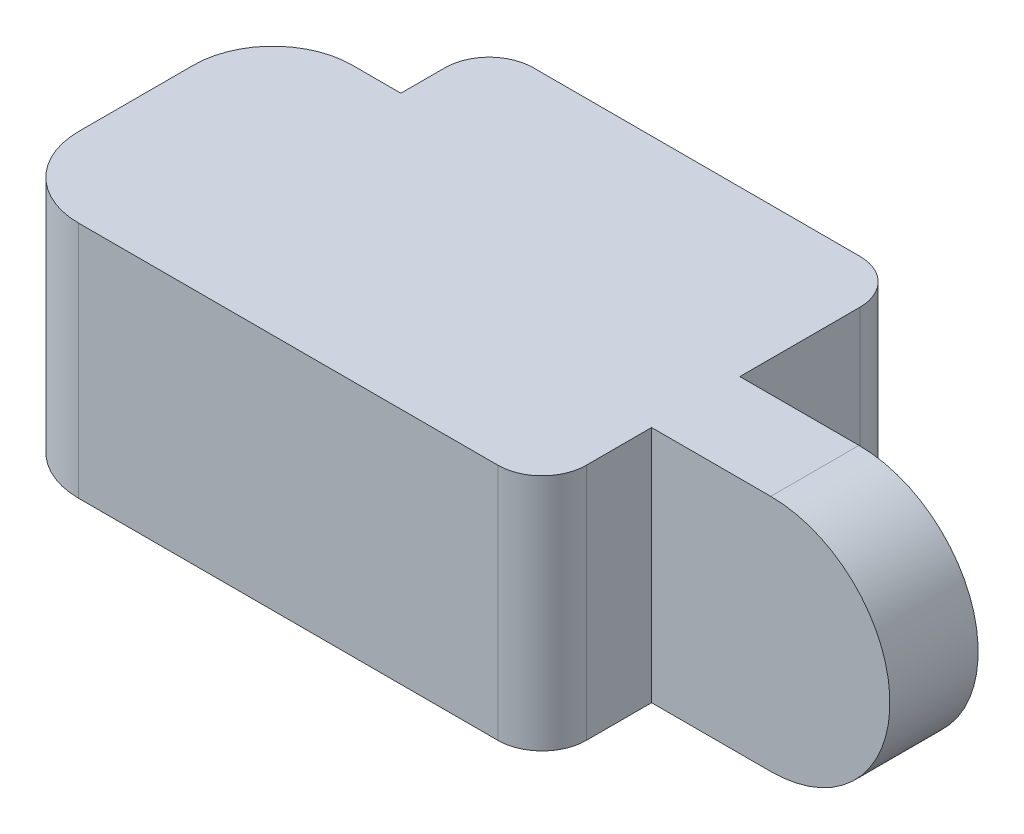
ISO-10303-21;
HEADER;
FILE_DESCRIPTION(('STEP AP214'),'2;1');
FILE_NAME('part.step','',(''),(''),'','','');
FILE_SCHEMA(('AUTOMOTIVE_DESIGN { 1 0 10303 214 1 1 1 1 }'));
ENDSEC;
DATA;
#1=APPLICATION_CONTEXT('core data for automotive mechanical design processes');
#2=APPLICATION_PROTOCOL_DEFINITION('international standard','automotive_design',2000,#1);
#3=PRODUCT_CONTEXT('',#1,'mechanical');
#4=PRODUCT('Part','Part','',(#3));
#5=PRODUCT_RELATED_PRODUCT_CATEGORY('part','',(#4));
#6=PRODUCT_DEFINITION_FORMATION('','',#4);
#7=PRODUCT_DEFINITION_CONTEXT('part definition',#1,'design');
#8=PRODUCT_DEFINITION('design','',#6,#7);
#9=PRODUCT_DEFINITION_SHAPE('','',#8);
#10=(LENGTH_UNIT() NAMED_UNIT(*) SI_UNIT(.MILLI.,.METRE.));
#11=(NAMED_UNIT(*) PLANE_ANGLE_UNIT() SI_UNIT($,.RADIAN.));
#12=(NAMED_UNIT(*) SI_UNIT($,.STERADIAN.) SOLID_ANGLE_UNIT());
#13=UNCERTAINTY_MEASURE_WITH_UNIT(LENGTH_MEASURE(1.E-05),#10,'distance_accuracy_value','');
#14=(GEOMETRIC_REPRESENTATION_CONTEXT(3) GLOBAL_UNCERTAINTY_ASSIGNED_CONTEXT((#13)) GLOBAL_UNIT_ASSIGNED_CONTEXT((#10,
#11,#12)) REPRESENTATION_CONTEXT('',''));
#15=CARTESIAN_POINT('',(0.,0.,0.));
#16=DIRECTION('',(0.,0.,1.));
#17=DIRECTION('',(1.,0.,0.));
#18=AXIS2_PLACEMENT_3D('',#15,#16,#17);
#19=CARTESIAN_POINT('',(-34.29,-34.29,12.7));
#20=DIRECTION('',(1.,0.,0.));
#21=DIRECTION('',(0.,0.,-1.));
#22=AXIS2_PLACEMENT_3D('',#19,#20,#21);
#23=PLANE('',#22);
#24=DIRECTION('',(0.,1.,0.));
#25=VECTOR('',#24,1.);
#26=CARTESIAN_POINT('',(-34.29,-34.29,12.7));
#27=LINE('',#26,#25);
#28=CARTESIAN_POINT('',(-34.29,-34.29,12.7));
#29=VERTEX_POINT('',#28);
#30=CARTESIAN_POINT('',(-34.29,34.29,12.7));
#31=VERTEX_POINT('',#30);
#32=EDGE_CURVE('E195',#29,#31,#27,.T.);
#33=ORIENTED_EDGE('',*,*,#32,.T.);
#34=DIRECTION('',(0.,0.,-1.));
#35=VECTOR('',#34,1.);
#36=CARTESIAN_POINT('',(-34.29,34.29,12.7));
#37=LINE('',#36,#35);
#38=CARTESIAN_POINT('',(-34.29,34.29,31.496));
#39=VERTEX_POINT('',#38);
#40=EDGE_CURVE('E151',#39,#31,#37,.T.);
#41=ORIENTED_EDGE('',*,*,#40,.F.);
#42=DIRECTION('',(0.,1.,0.));
#43=VECTOR('',#42,1.);
#44=CARTESIAN_POINT('',(-34.29,-34.29,31.496));
#45=LINE('',#44,#43);
#46=CARTESIAN_POINT('',(-34.29,-34.29,31.496));
#47=VERTEX_POINT('',#46);
#48=EDGE_CURVE('E39',#47,#39,#45,.T.);
#49=ORIENTED_EDGE('',*,*,#48,.F.);
#50=DIRECTION('',(0.,0.,-1.));
#51=VECTOR('',#50,1.);
#52=CARTESIAN_POINT('',(-34.29,-34.29,12.7));
#53=LINE('',#52,#51);
#54=EDGE_CURVE('E162',#47,#29,#53,.T.);
#55=ORIENTED_EDGE('',*,*,#54,.T.);
#56=EDGE_LOOP('',(#33,#41,#49,#55));
#57=FACE_BOUND('',#56,.T.);
#58=ADVANCED_FACE('F32',(#57),#23,.T.);
#59=CARTESIAN_POINT('',(-46.99,-34.29,31.496));
#60=DIRECTION('',(0.,1.,0.));
#61=DIRECTION('',(0.,0.,1.));
#62=AXIS2_PLACEMENT_3D('',#59,#60,#61);
#63=CYLINDRICAL_SURFACE('',#62,12.7);
#64=ORIENTED_EDGE('',*,*,#48,.T.);
#65=CARTESIAN_POINT('',(-46.99,34.29,31.496));
#66=DIRECTION('',(0.,1.,0.));
#67=DIRECTION('',(0.,0.,-1.));
#68=AXIS2_PLACEMENT_3D('',#65,#66,#67);
#69=CIRCLE('',#68,12.7);
#70=CARTESIAN_POINT('',(-46.99,34.29,44.196));
#71=VERTEX_POINT('',#70);
#72=EDGE_CURVE('E230',#71,#39,#69,.T.);
#73=ORIENTED_EDGE('',*,*,#72,.F.);
#74=DIRECTION('',(0.,1.,0.));
#75=VECTOR('',#74,1.);
#76=CARTESIAN_POINT('',(-46.99,-34.29,44.196));
#77=LINE('',#76,#75);
#78=CARTESIAN_POINT('',(-46.99,-34.29,44.196));
#79=VERTEX_POINT('',#78);
#80=EDGE_CURVE('E197',#79,#71,#77,.T.);
#81=ORIENTED_EDGE('',*,*,#80,.F.);
#82=CARTESIAN_POINT('',(-46.99,-34.29,31.496));
#83=DIRECTION('',(0.,1.,0.));
#84=DIRECTION('',(0.,0.,-1.));
#85=AXIS2_PLACEMENT_3D('',#82,#83,#84);
#86=CIRCLE('',#85,12.7);
#87=EDGE_CURVE('E192',#79,#47,#86,.T.);
#88=ORIENTED_EDGE('',*,*,#87,.T.);
#89=EDGE_LOOP('',(#64,#73,#81,#88));
#90=FACE_BOUND('',#89,.T.);
#91=ADVANCED_FACE('F268',(#90),#63,.T.);
#92=CARTESIAN_POINT('',(-46.99,-34.29,44.196));
#93=DIRECTION('',(0.,0.,1.));
#94=DIRECTION('',(1.,0.,0.));
#95=AXIS2_PLACEMENT_3D('',#92,#93,#94);
#96=PLANE('',#95);
#97=ORIENTED_EDGE('',*,*,#80,.T.);
#98=DIRECTION('',(1.,0.,0.));
#99=VECTOR('',#98,1.);
#100=CARTESIAN_POINT('',(-46.99,34.29,44.196));
#101=LINE('',#100,#99);
#102=CARTESIAN_POINT('',(-167.64,34.29,44.196));
#103=VERTEX_POINT('',#102);
#104=EDGE_CURVE('E262',#103,#71,#101,.T.);
#105=ORIENTED_EDGE('',*,*,#104,.F.);
#106=DIRECTION('',(0.,1.,0.));
#107=VECTOR('',#106,1.);
#108=CARTESIAN_POINT('',(-167.64,-34.29,44.196));
#109=LINE('',#108,#107);
#110=CARTESIAN_POINT('',(-167.64,-34.29,44.196));
#111=VERTEX_POINT('',#110);
#112=EDGE_CURVE('E199',#111,#103,#109,.T.);
#113=ORIENTED_EDGE('',*,*,#112,.F.);
#114=DIRECTION('',(1.,0.,0.));
#115=VECTOR('',#114,1.);
#116=CARTESIAN_POINT('',(-46.99,-34.29,44.196));
#117=LINE('',#116,#115);
#118=EDGE_CURVE('E189',#111,#79,#117,.T.);
#119=ORIENTED_EDGE('',*,*,#118,.T.);
#120=EDGE_LOOP('',(#97,#105,#113,#119));
#121=FACE_BOUND('',#120,.T.);
#122=ADVANCED_FACE('F316',(#121),#96,.T.);
#123=CARTESIAN_POINT('',(-167.64,-34.29,21.336));
#124=DIRECTION('',(0.,1.,0.));
#125=DIRECTION('',(0.,0.,1.));
#126=AXIS2_PLACEMENT_3D('',#123,#124,#125);
#127=CYLINDRICAL_SURFACE('',#126,22.86);
#128=ORIENTED_EDGE('',*,*,#112,.T.);
#129=CARTESIAN_POINT('',(-167.64,34.29,21.336));
#130=DIRECTION('',(0.,1.,0.));
#131=DIRECTION('',(0.,0.,-1.));
#132=AXIS2_PLACEMENT_3D('',#129,#130,#131);
#133=CIRCLE('',#132,22.86);
#134=CARTESIAN_POINT('',(-190.5,34.29,21.336));
#135=VERTEX_POINT('',#134);
#136=EDGE_CURVE('E259',#135,#103,#133,.T.);
#137=ORIENTED_EDGE('',*,*,#136,.F.);
#138=DIRECTION('',(0.,1.,0.));
#139=VECTOR('',#138,1.);
#140=CARTESIAN_POINT('',(-190.5,-34.29,21.336));
#141=LINE('',#140,#139);
#142=CARTESIAN_POINT('',(-190.5,-34.29,21.336));
#143=VERTEX_POINT('',#142);
#144=EDGE_CURVE('E201',#143,#135,#141,.T.);
#145=ORIENTED_EDGE('',*,*,#144,.F.);
#146=CARTESIAN_POINT('',(-167.64,-34.29,21.336));
#147=DIRECTION('',(0.,1.,0.));
#148=DIRECTION('',(0.,0.,-1.));
#149=AXIS2_PLACEMENT_3D('',#146,#147,#148);
#150=CIRCLE('',#149,22.86);
#151=EDGE_CURVE('E186',#143,#111,#150,.T.);
#152=ORIENTED_EDGE('',*,*,#151,.T.);
#153=EDGE_LOOP('',(#128,#137,#145,#152));
#154=FACE_BOUND('',#153,.T.);
#155=ADVANCED_FACE('F274',(#154),#127,.T.);
#156=CARTESIAN_POINT('',(-190.5,-34.29,-11.684));
#157=DIRECTION('',(-1.,0.,0.));
#158=DIRECTION('',(0.,0.,1.));
#159=AXIS2_PLACEMENT_3D('',#156,#157,#158);
#160=PLANE('',#159);
#161=ORIENTED_EDGE('',*,*,#144,.T.);
#162=DIRECTION('',(0.,0.,1.));
#163=VECTOR('',#162,1.);
#164=CARTESIAN_POINT('',(-190.5,34.29,-11.684));
#165=LINE('',#164,#163);
#166=CARTESIAN_POINT('',(-190.5,34.29,-11.684));
#167=VERTEX_POINT('',#166);
#168=EDGE_CURVE('E256',#167,#135,#165,.T.);
#169=ORIENTED_EDGE('',*,*,#168,.F.);
#170=DIRECTION('',(0.,1.,0.));
#171=VECTOR('',#170,1.);
#172=CARTESIAN_POINT('',(-190.5,-34.29,-11.684));
#173=LINE('',#172,#171);
#174=CARTESIAN_POINT('',(-190.5,-34.29,-11.684));
#175=VERTEX_POINT('',#174);
#176=EDGE_CURVE('E203',#175,#167,#173,.T.);
#177=ORIENTED_EDGE('',*,*,#176,.F.);
#178=DIRECTION('',(0.,0.,1.));
#179=VECTOR('',#178,1.);
#180=CARTESIAN_POINT('',(-190.5,-34.29,-11.684));
#181=LINE('',#180,#179);
#182=EDGE_CURVE('E183',#175,#143,#181,.T.);
#183=ORIENTED_EDGE('',*,*,#182,.T.);
#184=EDGE_LOOP('',(#161,#169,#177,#183));
#185=FACE_BOUND('',#184,.T.);
#186=ADVANCED_FACE('F277',(#185),#160,.T.);
#187=CARTESIAN_POINT('',(-167.64,-34.29,-11.684));
#188=DIRECTION('',(0.,1.,0.));
#189=DIRECTION('',(0.,0.,1.));
#190=AXIS2_PLACEMENT_3D('',#187,#188,#189);
#191=CYLINDRICAL_SURFACE('',#190,22.86);
#192=ORIENTED_EDGE('',*,*,#176,.T.);
#193=CARTESIAN_POINT('',(-167.64,34.29,-11.684));
#194=DIRECTION('',(0.,1.,0.));
#195=DIRECTION('',(0.,0.,1.));
#196=AXIS2_PLACEMENT_3D('',#193,#194,#195);
#197=CIRCLE('',#196,22.86);
#198=CARTESIAN_POINT('',(-167.64,34.29,-34.544));
#199=VERTEX_POINT('',#198);
#200=EDGE_CURVE('E253',#199,#167,#197,.T.);
#201=ORIENTED_EDGE('',*,*,#200,.F.);
#202=DIRECTION('',(0.,1.,0.));
#203=VECTOR('',#202,1.);
#204=CARTESIAN_POINT('',(-167.64,-34.29,-34.544));
#205=LINE('',#204,#203);
#206=CARTESIAN_POINT('',(-167.64,-34.29,-34.544));
#207=VERTEX_POINT('',#206);
#208=EDGE_CURVE('E205',#207,#199,#205,.T.);
#209=ORIENTED_EDGE('',*,*,#208,.F.);
#210=CARTESIAN_POINT('',(-167.64,-34.29,-11.684));
#211=DIRECTION('',(0.,1.,0.));
#212=DIRECTION('',(0.,0.,1.));
#213=AXIS2_PLACEMENT_3D('',#210,#211,#212);
#214=CIRCLE('',#213,22.86);
#215=EDGE_CURVE('E180',#207,#175,#214,.T.);
#216=ORIENTED_EDGE('',*,*,#215,.T.);
#217=EDGE_LOOP('',(#192,#201,#209,#216));
#218=FACE_BOUND('',#217,.T.);
#219=ADVANCED_FACE('F281',(#218),#191,.T.);
#220=CARTESIAN_POINT('',(-153.67,-34.29,-34.544));
#221=DIRECTION('',(0.,0.,-1.));
#222=DIRECTION('',(-1.,0.,0.));
#223=AXIS2_PLACEMENT_3D('',#220,#221,#222);
#224=PLANE('',#223);
#225=ORIENTED_EDGE('',*,*,#208,.T.);
#226=DIRECTION('',(-1.,0.,0.));
#227=VECTOR('',#226,1.);
#228=CARTESIAN_POINT('',(-153.67,34.29,-34.544));
#229=LINE('',#228,#227);
#230=CARTESIAN_POINT('',(-153.67,34.29,-34.544));
#231=VERTEX_POINT('',#230);
#232=EDGE_CURVE('E250',#231,#199,#229,.T.);
#233=ORIENTED_EDGE('',*,*,#232,.F.);
#234=DIRECTION('',(0.,1.,0.));
#235=VECTOR('',#234,1.);
#236=CARTESIAN_POINT('',(-153.67,-34.29,-34.544));
#237=LINE('',#236,#235);
#238=CARTESIAN_POINT('',(-153.67,-34.29,-34.544));
#239=VERTEX_POINT('',#238);
#240=EDGE_CURVE('E207',#239,#231,#237,.T.);
#241=ORIENTED_EDGE('',*,*,#240,.F.);
#242=DIRECTION('',(-1.,0.,0.));
#243=VECTOR('',#242,1.);
#244=CARTESIAN_POINT('',(-153.67,-34.29,-34.544));
#245=LINE('',#244,#243);
#246=EDGE_CURVE('E177',#239,#207,#245,.T.);
#247=ORIENTED_EDGE('',*,*,#246,.T.);
#248=EDGE_LOOP('',(#225,#233,#241,#247));
#249=FACE_BOUND('',#248,.T.);
#250=ADVANCED_FACE('F286',(#249),#224,.T.);
#251=CARTESIAN_POINT('',(-153.67,-34.29,-47.244));
#252=DIRECTION('',(-1.,0.,0.));
#253=DIRECTION('',(0.,0.,1.));
#254=AXIS2_PLACEMENT_3D('',#251,#252,#253);
#255=PLANE('',#254);
#256=ORIENTED_EDGE('',*,*,#240,.T.);
#257=DIRECTION('',(0.,0.,1.));
#258=VECTOR('',#257,1.);
#259=CARTESIAN_POINT('',(-153.67,34.29,-47.244));
#260=LINE('',#259,#258);
#261=CARTESIAN_POINT('',(-153.67,34.29,-47.244));
#262=VERTEX_POINT('',#261);
#263=EDGE_CURVE('E247',#262,#231,#260,.T.);
#264=ORIENTED_EDGE('',*,*,#263,.F.);
#265=DIRECTION('',(0.,1.,0.));
#266=VECTOR('',#265,1.);
#267=CARTESIAN_POINT('',(-153.67,-34.29,-47.244));
#268=LINE('',#267,#266);
#269=CARTESIAN_POINT('',(-153.67,-34.29,-47.244));
#270=VERTEX_POINT('',#269);
#271=EDGE_CURVE('E209',#270,#262,#268,.T.);
#272=ORIENTED_EDGE('',*,*,#271,.F.);
#273=DIRECTION('',(0.,0.,1.));
#274=VECTOR('',#273,1.);
#275=CARTESIAN_POINT('',(-153.67,-34.29,-47.244));
#276=LINE('',#275,#274);
#277=EDGE_CURVE('E174',#270,#239,#276,.T.);
#278=ORIENTED_EDGE('',*,*,#277,.T.);
#279=EDGE_LOOP('',(#256,#264,#272,#278));
#280=FACE_BOUND('',#279,.T.);
#281=ADVANCED_FACE('F289',(#280),#255,.T.);
#282=CARTESIAN_POINT('',(-140.97,-34.29,-47.244));
#283=DIRECTION('',(0.,1.,0.));
#284=DIRECTION('',(0.,0.,1.));
#285=AXIS2_PLACEMENT_3D('',#282,#283,#284);
#286=CYLINDRICAL_SURFACE('',#285,12.7);
#287=ORIENTED_EDGE('',*,*,#271,.T.);
#288=CARTESIAN_POINT('',(-140.97,34.29,-47.244));
#289=DIRECTION('',(0.,1.,0.));
#290=DIRECTION('',(0.,0.,1.));
#291=AXIS2_PLACEMENT_3D('',#288,#289,#290);
#292=CIRCLE('',#291,12.7);
#293=CARTESIAN_POINT('',(-140.97,34.29,-59.944));
#294=VERTEX_POINT('',#293);
#295=EDGE_CURVE('E244',#294,#262,#292,.T.);
#296=ORIENTED_EDGE('',*,*,#295,.F.);
#297=DIRECTION('',(0.,1.,0.));
#298=VECTOR('',#297,1.);
#299=CARTESIAN_POINT('',(-140.97,-34.29,-59.944));
#300=LINE('',#299,#298);
#301=CARTESIAN_POINT('',(-140.97,-34.29,-59.944));
#302=VERTEX_POINT('',#301);
#303=EDGE_CURVE('E211',#302,#294,#300,.T.);
#304=ORIENTED_EDGE('',*,*,#303,.F.);
#305=CARTESIAN_POINT('',(-140.97,-34.29,-47.244));
#306=DIRECTION('',(0.,1.,0.));
#307=DIRECTION('',(0.,0.,1.));
#308=AXIS2_PLACEMENT_3D('',#305,#306,#307);
#309=CIRCLE('',#308,12.7);
#310=EDGE_CURVE('E171',#302,#270,#309,.T.);
#311=ORIENTED_EDGE('',*,*,#310,.T.);
#312=EDGE_LOOP('',(#287,#296,#304,#311));
#313=FACE_BOUND('',#312,.T.);
#314=ADVANCED_FACE('F293',(#313),#286,.T.);
#315=CARTESIAN_POINT('',(-46.99,-34.29,-59.944));
#316=DIRECTION('',(0.,0.,-1.));
#317=DIRECTION('',(-1.,0.,0.));
#318=AXIS2_PLACEMENT_3D('',#315,#316,#317);
#319=PLANE('',#318);
#320=ORIENTED_EDGE('',*,*,#303,.T.);
#321=DIRECTION('',(-1.,0.,0.));
#322=VECTOR('',#321,1.);
#323=CARTESIAN_POINT('',(-46.99,34.29,-59.944));
#324=LINE('',#323,#322);
#325=CARTESIAN_POINT('',(-46.99,34.29,-59.944));
#326=VERTEX_POINT('',#325);
#327=EDGE_CURVE('E241',#326,#294,#324,.T.);
#328=ORIENTED_EDGE('',*,*,#327,.F.);
#329=DIRECTION('',(0.,1.,0.));
#330=VECTOR('',#329,1.);
#331=CARTESIAN_POINT('',(-46.99,-34.29,-59.944));
#332=LINE('',#331,#330);
#333=CARTESIAN_POINT('',(-46.99,-34.29,-59.944));
#334=VERTEX_POINT('',#333);
#335=EDGE_CURVE('E213',#334,#326,#332,.T.);
#336=ORIENTED_EDGE('',*,*,#335,.F.);
#337=DIRECTION('',(-1.,0.,0.));
#338=VECTOR('',#337,1.);
#339=CARTESIAN_POINT('',(-46.99,-34.29,-59.944));
#340=LINE('',#339,#338);
#341=EDGE_CURVE('E168',#334,#302,#340,.T.);
#342=ORIENTED_EDGE('',*,*,#341,.T.);
#343=EDGE_LOOP('',(#320,#328,#336,#342));
#344=FACE_BOUND('',#343,.T.);
#345=ADVANCED_FACE('F297',(#344),#319,.T.);
#346=CARTESIAN_POINT('',(-46.99,-34.29,-47.244));
#347=DIRECTION('',(0.,1.,0.));
#348=DIRECTION('',(0.,0.,1.));
#349=AXIS2_PLACEMENT_3D('',#346,#347,#348);
#350=CYLINDRICAL_SURFACE('',#349,12.7);
#351=ORIENTED_EDGE('',*,*,#335,.T.);
#352=CARTESIAN_POINT('',(-46.99,34.29,-47.244));
#353=DIRECTION('',(0.,1.,0.));
#354=DIRECTION('',(0.,0.,-1.));
#355=AXIS2_PLACEMENT_3D('',#352,#353,#354);
#356=CIRCLE('',#355,12.7);
#357=CARTESIAN_POINT('',(-34.29,34.29,-47.244));
#358=VERTEX_POINT('',#357);
#359=EDGE_CURVE('E238',#358,#326,#356,.T.);
#360=ORIENTED_EDGE('',*,*,#359,.F.);
#361=DIRECTION('',(0.,1.,0.));
#362=VECTOR('',#361,1.);
#363=CARTESIAN_POINT('',(-34.29,-34.29,-47.244));
#364=LINE('',#363,#362);
#365=CARTESIAN_POINT('',(-34.29,-34.29,-47.244));
#366=VERTEX_POINT('',#365);
#367=EDGE_CURVE('E215',#366,#358,#364,.T.);
#368=ORIENTED_EDGE('',*,*,#367,.F.);
#369=CARTESIAN_POINT('',(-46.99,-34.29,-47.244));
#370=DIRECTION('',(0.,1.,0.));
#371=DIRECTION('',(0.,0.,-1.));
#372=AXIS2_PLACEMENT_3D('',#369,#370,#371);
#373=CIRCLE('',#372,12.7);
#374=EDGE_CURVE('E160',#366,#334,#373,.T.);
#375=ORIENTED_EDGE('',*,*,#374,.T.);
#376=EDGE_LOOP('',(#351,#360,#368,#375));
#377=FACE_BOUND('',#376,.T.);
#378=ADVANCED_FACE('F300',(#377),#350,.T.);
#379=CARTESIAN_POINT('',(-34.29,-34.29,-47.244));
#380=DIRECTION('',(1.,0.,0.));
#381=DIRECTION('',(0.,0.,-1.));
#382=AXIS2_PLACEMENT_3D('',#379,#380,#381);
#383=PLANE('',#382);
#384=ORIENTED_EDGE('',*,*,#367,.T.);
#385=DIRECTION('',(0.,0.,-1.));
#386=VECTOR('',#385,1.);
#387=CARTESIAN_POINT('',(-34.29,34.29,-47.244));
#388=LINE('',#387,#386);
#389=CARTESIAN_POINT('',(-34.29,34.29,-12.7));
#390=VERTEX_POINT('',#389);
#391=EDGE_CURVE('E235',#390,#358,#388,.T.);
#392=ORIENTED_EDGE('',*,*,#391,.F.);
#393=DIRECTION('',(0.,1.,0.));
#394=VECTOR('',#393,1.);
#395=CARTESIAN_POINT('',(-34.29,-34.29,-12.7));
#396=LINE('',#395,#394);
#397=CARTESIAN_POINT('',(-34.29,-34.29,-12.7));
#398=VERTEX_POINT('',#397);
#399=EDGE_CURVE('E217',#398,#390,#396,.T.);
#400=ORIENTED_EDGE('',*,*,#399,.F.);
#401=DIRECTION('',(0.,0.,-1.));
#402=VECTOR('',#401,1.);
#403=CARTESIAN_POINT('',(-34.29,-34.29,-47.244));
#404=LINE('',#403,#402);
#405=EDGE_CURVE('E157',#398,#366,#404,.T.);
#406=ORIENTED_EDGE('',*,*,#405,.T.);
#407=EDGE_LOOP('',(#384,#392,#400,#406));
#408=FACE_BOUND('',#407,.T.);
#409=ADVANCED_FACE('F303',(#408),#383,.T.);
#410=CARTESIAN_POINT('',(-34.29,-34.29,-12.7));
#411=DIRECTION('',(0.,0.,-1.));
#412=DIRECTION('',(-1.,0.,0.));
#413=AXIS2_PLACEMENT_3D('',#410,#411,#412);
#414=PLANE('',#413);
#415=CARTESIAN_POINT('',(0.,0.,-12.7));
#416=DIRECTION('',(0.,0.,-1.));
#417=DIRECTION('',(-1.,0.,0.));
#418=AXIS2_PLACEMENT_3D('',#415,#416,#417);
#419=CIRCLE('',#418,34.29);
#420=CARTESIAN_POINT('',(0.,-34.29,-12.7));
#421=VERTEX_POINT('',#420);
#422=CARTESIAN_POINT('',(0.,34.29,-12.7));
#423=VERTEX_POINT('',#422);
#424=EDGE_CURVE('E46',#421,#423,#419,.F.);
#425=ORIENTED_EDGE('',*,*,#424,.F.);
#426=DIRECTION('',(-1.,0.,0.));
#427=VECTOR('',#426,1.);
#428=CARTESIAN_POINT('',(-34.29,-34.29,-12.7));
#429=LINE('',#428,#427);
#430=EDGE_CURVE('E148',#421,#398,#429,.T.);
#431=ORIENTED_EDGE('',*,*,#430,.T.);
#432=ORIENTED_EDGE('',*,*,#399,.T.);
#433=DIRECTION('',(-1.,0.,0.));
#434=VECTOR('',#433,1.);
#435=CARTESIAN_POINT('',(-34.29,34.29,-12.7));
#436=LINE('',#435,#434);
#437=EDGE_CURVE('E150',#423,#390,#436,.T.);
#438=ORIENTED_EDGE('',*,*,#437,.F.);
#439=EDGE_LOOP('',(#425,#431,#432,#438));
#440=FACE_BOUND('',#439,.T.);
#441=ADVANCED_FACE('F146',(#440),#414,.T.);
#442=CARTESIAN_POINT('',(-34.29,-34.29,12.7));
#443=DIRECTION('',(0.,0.,1.));
#444=DIRECTION('',(1.,0.,0.));
#445=AXIS2_PLACEMENT_3D('',#442,#443,#444);
#446=PLANE('',#445);
#447=DIRECTION('',(1.,0.,0.));
#448=VECTOR('',#447,1.);
#449=CARTESIAN_POINT('',(-34.29,-34.29,12.7));
#450=LINE('',#449,#448);
#451=CARTESIAN_POINT('',(0.,-34.29,12.7));
#452=VERTEX_POINT('',#451);
#453=EDGE_CURVE('E158',#29,#452,#450,.T.);
#454=ORIENTED_EDGE('',*,*,#453,.T.);
#455=CARTESIAN_POINT('',(0.,0.,12.7));
#456=DIRECTION('',(0.,0.,1.));
#457=DIRECTION('',(1.,0.,0.));
#458=AXIS2_PLACEMENT_3D('',#455,#456,#457);
#459=CIRCLE('',#458,34.29);
#460=CARTESIAN_POINT('',(0.,34.29,12.7));
#461=VERTEX_POINT('',#460);
#462=EDGE_CURVE('E138',#461,#452,#459,.F.);
#463=ORIENTED_EDGE('',*,*,#462,.F.);
#464=DIRECTION('',(1.,0.,0.));
#465=VECTOR('',#464,1.);
#466=CARTESIAN_POINT('',(-34.29,34.29,12.7));
#467=LINE('',#466,#465);
#468=EDGE_CURVE('E222',#31,#461,#467,.T.);
#469=ORIENTED_EDGE('',*,*,#468,.F.);
#470=ORIENTED_EDGE('',*,*,#32,.F.);
#471=EDGE_LOOP('',(#454,#463,#469,#470));
#472=FACE_BOUND('',#471,.T.);
#473=ADVANCED_FACE('F223',(#472),#446,.T.);
#474=CARTESIAN_POINT('',(-46.99,-34.29,31.496));
#475=DIRECTION('',(0.,-1.,0.));
#476=DIRECTION('',(0.,0.,-1.));
#477=AXIS2_PLACEMENT_3D('',#474,#475,#476);
#478=PLANE('',#477);
#479=DIRECTION('',(0.,0.,1.));
#480=VECTOR('',#479,1.);
#481=CARTESIAN_POINT('',(0.,-34.29,-59.944));
#482=LINE('',#481,#480);
#483=EDGE_CURVE('E135',#421,#452,#482,.T.);
#484=ORIENTED_EDGE('',*,*,#483,.T.);
#485=ORIENTED_EDGE('',*,*,#453,.F.);
#486=ORIENTED_EDGE('',*,*,#54,.F.);
#487=ORIENTED_EDGE('',*,*,#87,.F.);
#488=ORIENTED_EDGE('',*,*,#118,.F.);
#489=ORIENTED_EDGE('',*,*,#151,.F.);
#490=ORIENTED_EDGE('',*,*,#182,.F.);
#491=ORIENTED_EDGE('',*,*,#215,.F.);
#492=ORIENTED_EDGE('',*,*,#246,.F.);
#493=ORIENTED_EDGE('',*,*,#277,.F.);
#494=ORIENTED_EDGE('',*,*,#310,.F.);
#495=ORIENTED_EDGE('',*,*,#341,.F.);
#496=ORIENTED_EDGE('',*,*,#374,.F.);
#497=ORIENTED_EDGE('',*,*,#405,.F.);
#498=ORIENTED_EDGE('',*,*,#430,.F.);
#499=EDGE_LOOP('',(#484,#485,#486,#487,#488,#489,#490,#491,#492,#493,#494,#495,#496,#497,#498));
#500=FACE_BOUND('',#499,.T.);
#501=ADVANCED_FACE('F154',(#500),#478,.T.);
#502=CARTESIAN_POINT('',(-46.99,34.29,31.496));
#503=DIRECTION('',(0.,-1.,0.));
#504=DIRECTION('',(0.,0.,-1.));
#505=AXIS2_PLACEMENT_3D('',#502,#503,#504);
#506=PLANE('',#505);
#507=ORIENTED_EDGE('',*,*,#468,.T.);
#508=DIRECTION('',(0.,0.,1.));
#509=VECTOR('',#508,1.);
#510=CARTESIAN_POINT('',(0.,34.29,-59.944));
#511=LINE('',#510,#509);
#512=EDGE_CURVE('E11',#461,#423,#511,.F.);
#513=ORIENTED_EDGE('',*,*,#512,.T.);
#514=ORIENTED_EDGE('',*,*,#437,.T.);
#515=ORIENTED_EDGE('',*,*,#391,.T.);
#516=ORIENTED_EDGE('',*,*,#359,.T.);
#517=ORIENTED_EDGE('',*,*,#327,.T.);
#518=ORIENTED_EDGE('',*,*,#295,.T.);
#519=ORIENTED_EDGE('',*,*,#263,.T.);
#520=ORIENTED_EDGE('',*,*,#232,.T.);
#521=ORIENTED_EDGE('',*,*,#200,.T.);
#522=ORIENTED_EDGE('',*,*,#168,.T.);
#523=ORIENTED_EDGE('',*,*,#136,.T.);
#524=ORIENTED_EDGE('',*,*,#104,.T.);
#525=ORIENTED_EDGE('',*,*,#72,.T.);
#526=ORIENTED_EDGE('',*,*,#40,.T.);
#527=EDGE_LOOP('',(#507,#513,#514,#515,#516,#517,#518,#519,#520,#521,#522,#523,#524,#525,#526));
#528=FACE_BOUND('',#527,.T.);
#529=ADVANCED_FACE('F227',(#528),#506,.F.);
#530=CARTESIAN_POINT('',(0.,0.,-59.944));
#531=DIRECTION('',(0.,0.,1.));
#532=DIRECTION('',(1.,0.,0.));
#533=AXIS2_PLACEMENT_3D('',#530,#531,#532);
#534=CYLINDRICAL_SURFACE('',#533,34.29);
#535=ORIENTED_EDGE('',*,*,#424,.T.);
#536=ORIENTED_EDGE('',*,*,#512,.F.);
#537=ORIENTED_EDGE('',*,*,#462,.T.);
#538=ORIENTED_EDGE('',*,*,#483,.F.);
#539=EDGE_LOOP('',(#535,#536,#537,#538));
#540=FACE_BOUND('',#539,.T.);
#541=ADVANCED_FACE('F136',(#540),#534,.T.);
#542=CLOSED_SHELL('',(#58,#91,#122,#155,#186,#219,#250,#281,#314,#345,#378,#409,#441,#473,#501,
#529,#541));
#543=MANIFOLD_SOLID_BREP('B2',#542);
#544=ADVANCED_BREP_SHAPE_REPRESENTATION('',(#18,#543),#14);
#545=SHAPE_DEFINITION_REPRESENTATION(#9,#544);
ENDSEC;
END-ISO-10303-21;
